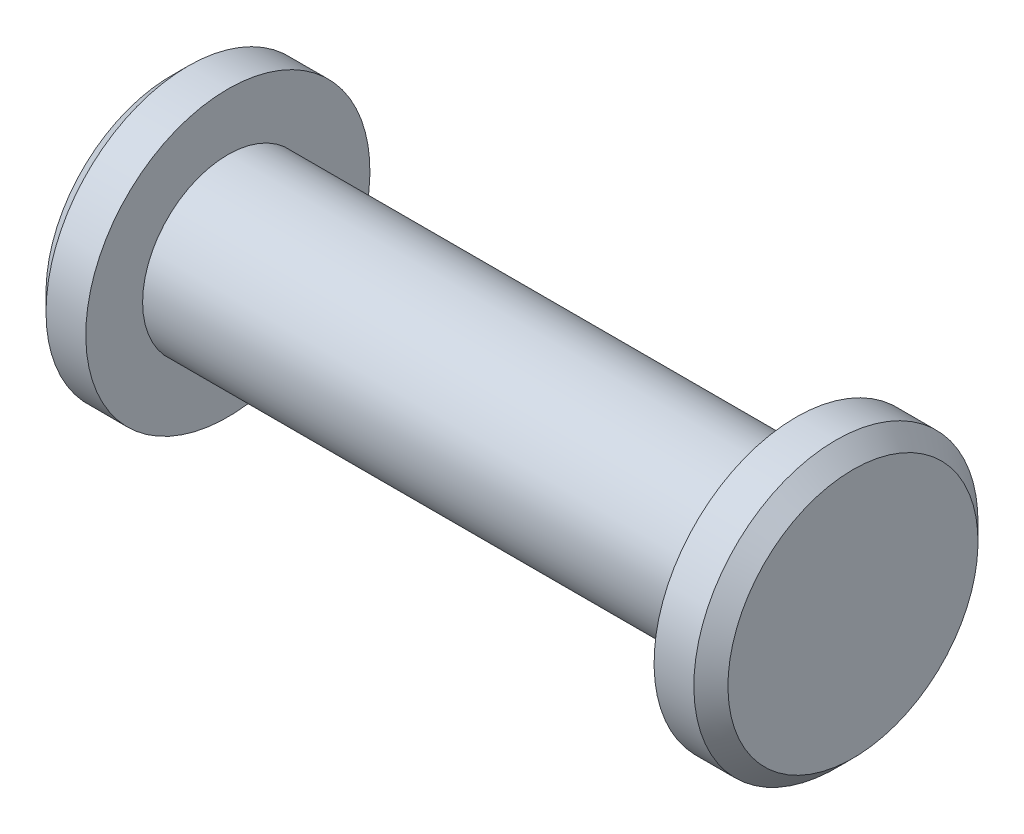
ISO-10303-21;
HEADER;
FILE_DESCRIPTION(('STEP AP214'),'2;1');
FILE_NAME('part.step','',(''),(''),'','','');
FILE_SCHEMA(('AUTOMOTIVE_DESIGN { 1 0 10303 214 1 1 1 1 }'));
ENDSEC;
DATA;
#1=APPLICATION_CONTEXT('core data for automotive mechanical design processes');
#2=APPLICATION_PROTOCOL_DEFINITION('international standard','automotive_design',2000,#1);
#3=PRODUCT_CONTEXT('',#1,'mechanical');
#4=PRODUCT('Part','Part','',(#3));
#5=PRODUCT_RELATED_PRODUCT_CATEGORY('part','',(#4));
#6=PRODUCT_DEFINITION_FORMATION('','',#4);
#7=PRODUCT_DEFINITION_CONTEXT('part definition',#1,'design');
#8=PRODUCT_DEFINITION('design','',#6,#7);
#9=PRODUCT_DEFINITION_SHAPE('','',#8);
#10=(LENGTH_UNIT() NAMED_UNIT(*) SI_UNIT(.MILLI.,.METRE.));
#11=(NAMED_UNIT(*) PLANE_ANGLE_UNIT() SI_UNIT($,.RADIAN.));
#12=(NAMED_UNIT(*) SI_UNIT($,.STERADIAN.) SOLID_ANGLE_UNIT());
#13=UNCERTAINTY_MEASURE_WITH_UNIT(LENGTH_MEASURE(1.E-05),#10,'distance_accuracy_value','');
#14=(GEOMETRIC_REPRESENTATION_CONTEXT(3) GLOBAL_UNCERTAINTY_ASSIGNED_CONTEXT((#13)) GLOBAL_UNIT_ASSIGNED_CONTEXT((#10,
#11,#12)) REPRESENTATION_CONTEXT('',''));
#15=CARTESIAN_POINT('',(0.,0.,0.));
#16=DIRECTION('',(0.,0.,1.));
#17=DIRECTION('',(1.,0.,0.));
#18=AXIS2_PLACEMENT_3D('',#15,#16,#17);
#19=CARTESIAN_POINT('',(0.,25.,0.));
#20=DIRECTION('',(1.,0.,0.));
#21=DIRECTION('',(0.,1.,0.));
#22=AXIS2_PLACEMENT_3D('',#19,#20,#21);
#23=PLANE('',#22);
#24=CARTESIAN_POINT('',(0.,0.,0.));
#25=DIRECTION('',(1.,0.,0.));
#26=DIRECTION('',(0.,1.,0.));
#27=AXIS2_PLACEMENT_3D('',#24,#25,#26);
#28=CIRCLE('',#27,22.0000000000001);
#29=CARTESIAN_POINT('',(0.,22.0000000000001,0.));
#30=VERTEX_POINT('',#29);
#31=EDGE_CURVE('E59',#30,#30,#28,.T.);
#32=ORIENTED_EDGE('',*,*,#31,.T.);
#33=EDGE_LOOP('',(#32));
#34=FACE_BOUND('',#33,.T.);
#35=ADVANCED_FACE('F43',(#34),#23,.T.);
#36=CARTESIAN_POINT('',(-120.,0.,0.));
#37=DIRECTION('',(-1.,0.,0.));
#38=DIRECTION('',(0.,-1.,0.));
#39=AXIS2_PLACEMENT_3D('',#36,#37,#38);
#40=PLANE('',#39);
#41=CARTESIAN_POINT('',(-120.,0.,0.));
#42=DIRECTION('',(-1.,0.,0.));
#43=DIRECTION('',(0.,-1.,0.));
#44=AXIS2_PLACEMENT_3D('',#41,#42,#43);
#45=CIRCLE('',#44,22.);
#46=CARTESIAN_POINT('',(-120.,-22.,0.));
#47=VERTEX_POINT('',#46);
#48=EDGE_CURVE('E10',#47,#47,#45,.T.);
#49=ORIENTED_EDGE('',*,*,#48,.T.);
#50=EDGE_LOOP('',(#49));
#51=FACE_BOUND('',#50,.T.);
#52=ADVANCED_FACE('F95',(#51),#40,.T.);
#53=CARTESIAN_POINT('',(0.,0.,0.));
#54=DIRECTION('',(1.,0.,0.));
#55=DIRECTION('',(0.,1.,0.));
#56=AXIS2_PLACEMENT_3D('',#53,#54,#55);
#57=CYLINDRICAL_SURFACE('',#56,25.);
#58=CARTESIAN_POINT('',(-117.,0.,0.));
#59=DIRECTION('',(-1.,0.,0.));
#60=DIRECTION('',(0.,-1.,0.));
#61=AXIS2_PLACEMENT_3D('',#58,#59,#60);
#62=CIRCLE('',#61,25.);
#63=CARTESIAN_POINT('',(-117.,-25.,0.));
#64=VERTEX_POINT('',#63);
#65=EDGE_CURVE('E51',#64,#64,#62,.F.);
#66=ORIENTED_EDGE('',*,*,#65,.T.);
#67=EDGE_LOOP('',(#66));
#68=FACE_BOUND('',#67,.T.);
#69=CARTESIAN_POINT('',(-110.,0.,0.));
#70=DIRECTION('',(1.,0.,0.));
#71=DIRECTION('',(0.,1.,0.));
#72=AXIS2_PLACEMENT_3D('',#69,#70,#71);
#73=CIRCLE('',#72,25.);
#74=CARTESIAN_POINT('',(-110.,25.,0.));
#75=VERTEX_POINT('',#74);
#76=EDGE_CURVE('E64',#75,#75,#73,.T.);
#77=ORIENTED_EDGE('',*,*,#76,.F.);
#78=EDGE_LOOP('',(#77));
#79=FACE_BOUND('',#78,.T.);
#80=ADVANCED_FACE('F101',(#68,#79),#57,.T.);
#81=CARTESIAN_POINT('',(-110.,25.,0.));
#82=DIRECTION('',(1.,0.,0.));
#83=DIRECTION('',(0.,1.,0.));
#84=AXIS2_PLACEMENT_3D('',#81,#82,#83);
#85=PLANE('',#84);
#86=ORIENTED_EDGE('',*,*,#76,.T.);
#87=EDGE_LOOP('',(#86));
#88=FACE_BOUND('',#87,.T.);
#89=CARTESIAN_POINT('',(-110.,0.,0.));
#90=DIRECTION('',(1.,0.,0.));
#91=DIRECTION('',(0.,1.,0.));
#92=AXIS2_PLACEMENT_3D('',#89,#90,#91);
#93=CIRCLE('',#92,15.);
#94=CARTESIAN_POINT('',(-110.,15.,0.));
#95=VERTEX_POINT('',#94);
#96=EDGE_CURVE('E67',#95,#95,#93,.T.);
#97=ORIENTED_EDGE('',*,*,#96,.F.);
#98=EDGE_LOOP('',(#97));
#99=FACE_BOUND('',#98,.T.);
#100=ADVANCED_FACE('F91',(#88,#99),#85,.T.);
#101=CARTESIAN_POINT('',(0.,0.,0.));
#102=DIRECTION('',(1.,0.,0.));
#103=DIRECTION('',(0.,1.,0.));
#104=AXIS2_PLACEMENT_3D('',#101,#102,#103);
#105=CYLINDRICAL_SURFACE('',#104,15.);
#106=ORIENTED_EDGE('',*,*,#96,.T.);
#107=EDGE_LOOP('',(#106));
#108=FACE_BOUND('',#107,.T.);
#109=CARTESIAN_POINT('',(-10.,0.,0.));
#110=DIRECTION('',(1.,0.,0.));
#111=DIRECTION('',(0.,1.,0.));
#112=AXIS2_PLACEMENT_3D('',#109,#110,#111);
#113=CIRCLE('',#112,15.);
#114=CARTESIAN_POINT('',(-10.,15.,0.));
#115=VERTEX_POINT('',#114);
#116=EDGE_CURVE('E70',#115,#115,#113,.T.);
#117=ORIENTED_EDGE('',*,*,#116,.F.);
#118=EDGE_LOOP('',(#117));
#119=FACE_BOUND('',#118,.T.);
#120=ADVANCED_FACE('F81',(#108,#119),#105,.T.);
#121=CARTESIAN_POINT('',(-10.,15.,0.));
#122=DIRECTION('',(-1.,0.,0.));
#123=DIRECTION('',(0.,-1.,0.));
#124=AXIS2_PLACEMENT_3D('',#121,#122,#123);
#125=PLANE('',#124);
#126=ORIENTED_EDGE('',*,*,#116,.T.);
#127=EDGE_LOOP('',(#126));
#128=FACE_BOUND('',#127,.T.);
#129=CARTESIAN_POINT('',(-10.,0.,0.));
#130=DIRECTION('',(1.,0.,0.));
#131=DIRECTION('',(0.,1.,0.));
#132=AXIS2_PLACEMENT_3D('',#129,#130,#131);
#133=CIRCLE('',#132,25.);
#134=CARTESIAN_POINT('',(-10.,25.,0.));
#135=VERTEX_POINT('',#134);
#136=EDGE_CURVE('E73',#135,#135,#133,.T.);
#137=ORIENTED_EDGE('',*,*,#136,.F.);
#138=EDGE_LOOP('',(#137));
#139=FACE_BOUND('',#138,.T.);
#140=ADVANCED_FACE('F79',(#128,#139),#125,.T.);
#141=CARTESIAN_POINT('',(0.,0.,0.));
#142=DIRECTION('',(1.,0.,0.));
#143=DIRECTION('',(0.,1.,0.));
#144=AXIS2_PLACEMENT_3D('',#141,#142,#143);
#145=CYLINDRICAL_SURFACE('',#144,25.);
#146=CARTESIAN_POINT('',(-2.99999999999995,0.,0.));
#147=DIRECTION('',(1.,0.,0.));
#148=DIRECTION('',(0.,1.,0.));
#149=AXIS2_PLACEMENT_3D('',#146,#147,#148);
#150=CIRCLE('',#149,25.);
#151=CARTESIAN_POINT('',(-2.99999999999995,25.,0.));
#152=VERTEX_POINT('',#151);
#153=EDGE_CURVE('E55',#152,#152,#150,.F.);
#154=ORIENTED_EDGE('',*,*,#153,.T.);
#155=EDGE_LOOP('',(#154));
#156=FACE_BOUND('',#155,.T.);
#157=ORIENTED_EDGE('',*,*,#136,.T.);
#158=EDGE_LOOP('',(#157));
#159=FACE_BOUND('',#158,.T.);
#160=ADVANCED_FACE('F77',(#156,#159),#145,.T.);
#161=CARTESIAN_POINT('',(0.,0.,0.));
#162=DIRECTION('',(-1.,0.,0.));
#163=DIRECTION('',(0.,-1.,0.));
#164=AXIS2_PLACEMENT_3D('',#161,#162,#163);
#165=CONICAL_SURFACE('',#164,22.0000000000001,0.785398163397448);
#166=ORIENTED_EDGE('',*,*,#153,.F.);
#167=EDGE_LOOP('',(#166));
#168=FACE_BOUND('',#167,.T.);
#169=ORIENTED_EDGE('',*,*,#31,.F.);
#170=EDGE_LOOP('',(#169));
#171=FACE_BOUND('',#170,.T.);
#172=ADVANCED_FACE('F88',(#168,#171),#165,.T.);
#173=CARTESIAN_POINT('',(-117.,0.,0.));
#174=DIRECTION('',(1.,0.,0.));
#175=DIRECTION('',(0.,1.,0.));
#176=AXIS2_PLACEMENT_3D('',#173,#174,#175);
#177=CONICAL_SURFACE('',#176,25.,0.78539816339745);
#178=ORIENTED_EDGE('',*,*,#48,.F.);
#179=EDGE_LOOP('',(#178));
#180=FACE_BOUND('',#179,.T.);
#181=ORIENTED_EDGE('',*,*,#65,.F.);
#182=EDGE_LOOP('',(#181));
#183=FACE_BOUND('',#182,.T.);
#184=ADVANCED_FACE('F46',(#180,#183),#177,.T.);
#185=CLOSED_SHELL('',(#35,#52,#80,#100,#120,#140,#160,#172,#184));
#186=MANIFOLD_SOLID_BREP('B2',#185);
#187=ADVANCED_BREP_SHAPE_REPRESENTATION('',(#18,#186),#14);
#188=SHAPE_DEFINITION_REPRESENTATION(#9,#187);
ENDSEC;
END-ISO-10303-21;
